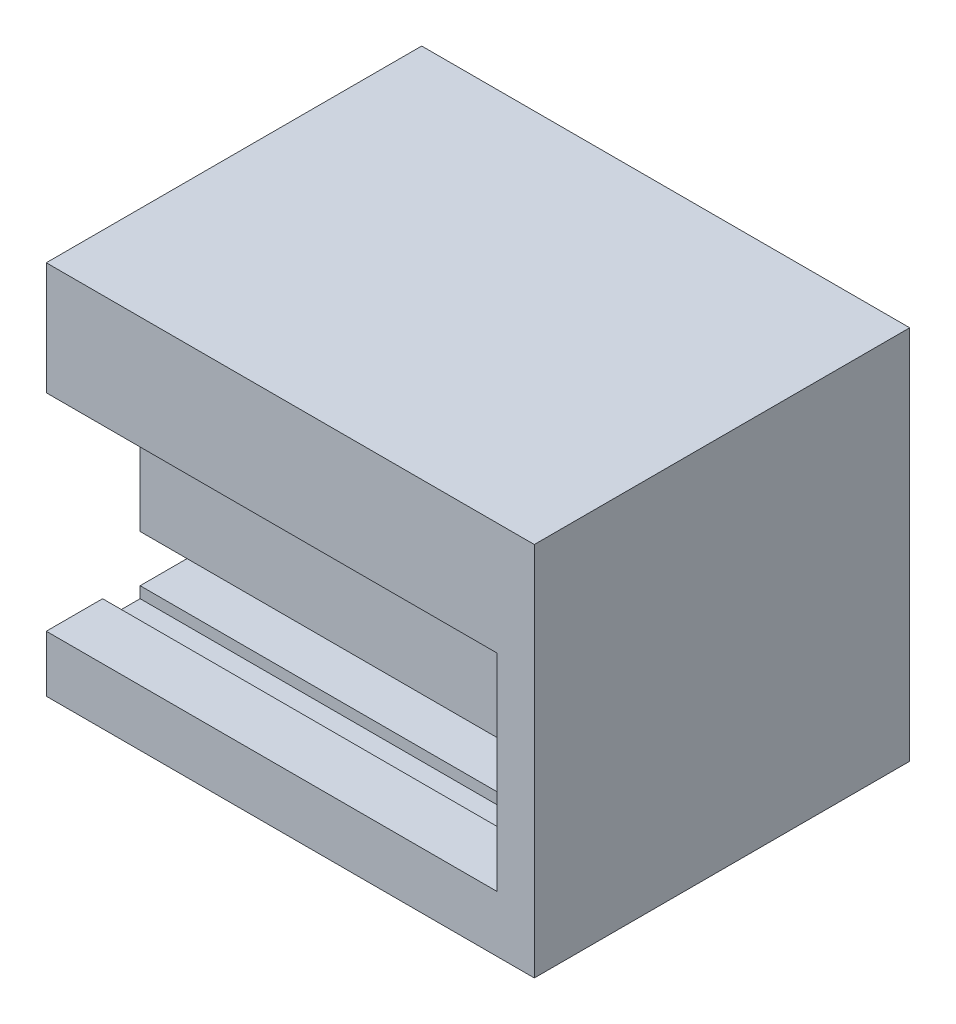
ISO-10303-21;
HEADER;
FILE_DESCRIPTION(('STEP AP214'),'2;1');
FILE_NAME('part.step','',(''),(''),'','','');
FILE_SCHEMA(('AUTOMOTIVE_DESIGN { 1 0 10303 214 1 1 1 1 }'));
ENDSEC;
DATA;
#1=APPLICATION_CONTEXT('core data for automotive mechanical design processes');
#2=APPLICATION_PROTOCOL_DEFINITION('international standard','automotive_design',2000,#1);
#3=PRODUCT_CONTEXT('',#1,'mechanical');
#4=PRODUCT('Part','Part','',(#3));
#5=PRODUCT_RELATED_PRODUCT_CATEGORY('part','',(#4));
#6=PRODUCT_DEFINITION_FORMATION('','',#4);
#7=PRODUCT_DEFINITION_CONTEXT('part definition',#1,'design');
#8=PRODUCT_DEFINITION('design','',#6,#7);
#9=PRODUCT_DEFINITION_SHAPE('','',#8);
#10=(LENGTH_UNIT() NAMED_UNIT(*) SI_UNIT(.MILLI.,.METRE.));
#11=(NAMED_UNIT(*) PLANE_ANGLE_UNIT() SI_UNIT($,.RADIAN.));
#12=(NAMED_UNIT(*) SI_UNIT($,.STERADIAN.) SOLID_ANGLE_UNIT());
#13=UNCERTAINTY_MEASURE_WITH_UNIT(LENGTH_MEASURE(1.E-05),#10,'distance_accuracy_value','');
#14=(GEOMETRIC_REPRESENTATION_CONTEXT(3) GLOBAL_UNCERTAINTY_ASSIGNED_CONTEXT((#13)) GLOBAL_UNIT_ASSIGNED_CONTEXT((#10,
#11,#12)) REPRESENTATION_CONTEXT('',''));
#15=CARTESIAN_POINT('',(0.,0.,0.));
#16=DIRECTION('',(0.,0.,1.));
#17=DIRECTION('',(1.,0.,0.));
#18=AXIS2_PLACEMENT_3D('',#15,#16,#17);
#19=CARTESIAN_POINT('',(-19.4844736842105,15.0951754385965,-25.4));
#20=DIRECTION('',(-1.,0.,0.));
#21=DIRECTION('',(0.,-1.,0.));
#22=AXIS2_PLACEMENT_3D('',#19,#20,#21);
#23=PLANE('',#22);
#24=DIRECTION('',(0.,-1.,0.));
#25=VECTOR('',#24,1.);
#26=CARTESIAN_POINT('',(-19.4844736842105,15.0951754385965,-3.81));
#27=LINE('',#26,#25);
#28=CARTESIAN_POINT('',(-19.4844736842105,12.5551754385965,-3.81));
#29=VERTEX_POINT('',#28);
#30=CARTESIAN_POINT('',(-19.4844736842105,7.47517543859648,-3.81));
#31=VERTEX_POINT('',#30);
#32=EDGE_CURVE('E201',#29,#31,#27,.T.);
#33=ORIENTED_EDGE('',*,*,#32,.T.);
#34=DIRECTION('',(0.,0.,1.));
#35=VECTOR('',#34,1.);
#36=CARTESIAN_POINT('',(-19.4844736842105,7.47517543859648,-25.4));
#37=LINE('',#36,#35);
#38=CARTESIAN_POINT('',(-19.4844736842105,7.47517543859648,0.));
#39=VERTEX_POINT('',#38);
#40=EDGE_CURVE('E203',#31,#39,#37,.T.);
#41=ORIENTED_EDGE('',*,*,#40,.T.);
#42=DIRECTION('',(0.,-1.,0.));
#43=VECTOR('',#42,1.);
#44=CARTESIAN_POINT('',(-19.4844736842105,15.0951754385965,0.));
#45=LINE('',#44,#43);
#46=CARTESIAN_POINT('',(-19.4844736842105,15.0951754385965,0.));
#47=VERTEX_POINT('',#46);
#48=EDGE_CURVE('E320',#47,#39,#45,.T.);
#49=ORIENTED_EDGE('',*,*,#48,.F.);
#50=DIRECTION('',(0.,0.,1.));
#51=VECTOR('',#50,1.);
#52=CARTESIAN_POINT('',(-19.4844736842105,15.0951754385965,-25.4));
#53=LINE('',#52,#51);
#54=CARTESIAN_POINT('',(-19.4844736842105,15.0951754385965,-25.4));
#55=VERTEX_POINT('',#54);
#56=EDGE_CURVE('E331',#55,#47,#53,.T.);
#57=ORIENTED_EDGE('',*,*,#56,.F.);
#58=DIRECTION('',(0.,-1.,0.));
#59=VECTOR('',#58,1.);
#60=CARTESIAN_POINT('',(-19.4844736842105,15.0951754385965,-25.4));
#61=LINE('',#60,#59);
#62=CARTESIAN_POINT('',(-19.4844736842105,-10.3048245614035,-25.4));
#63=VERTEX_POINT('',#62);
#64=EDGE_CURVE('E327',#55,#63,#61,.T.);
#65=ORIENTED_EDGE('',*,*,#64,.T.);
#66=DIRECTION('',(0.,0.,1.));
#67=VECTOR('',#66,1.);
#68=CARTESIAN_POINT('',(-19.4844736842105,-10.3048245614035,-25.4));
#69=LINE('',#68,#67);
#70=CARTESIAN_POINT('',(-19.4844736842105,-10.3048245614035,0.));
#71=VERTEX_POINT('',#70);
#72=EDGE_CURVE('E349',#63,#71,#69,.T.);
#73=ORIENTED_EDGE('',*,*,#72,.T.);
#74=CARTESIAN_POINT('',(-19.4844736842105,-6.49482456140353,0.));
#75=VERTEX_POINT('',#74);
#76=EDGE_CURVE('E343',#75,#71,#45,.T.);
#77=ORIENTED_EDGE('',*,*,#76,.F.);
#78=DIRECTION('',(0.,0.,-1.));
#79=VECTOR('',#78,1.);
#80=CARTESIAN_POINT('',(-19.4844736842105,-6.49482456140353,-25.4));
#81=LINE('',#80,#79);
#82=CARTESIAN_POINT('',(-19.4844736842105,-6.49482456140353,-3.81));
#83=VERTEX_POINT('',#82);
#84=EDGE_CURVE('E188',#75,#83,#81,.T.);
#85=ORIENTED_EDGE('',*,*,#84,.T.);
#86=DIRECTION('',(0.,-1.,0.));
#87=VECTOR('',#86,1.);
#88=CARTESIAN_POINT('',(-19.4844736842105,15.0951754385965,-3.81));
#89=LINE('',#88,#87);
#90=CARTESIAN_POINT('',(-19.4844736842105,-7.76482456140353,-3.81));
#91=VERTEX_POINT('',#90);
#92=EDGE_CURVE('E194',#83,#91,#89,.T.);
#93=ORIENTED_EDGE('',*,*,#92,.T.);
#94=DIRECTION('',(0.,0.,-1.));
#95=VECTOR('',#94,1.);
#96=CARTESIAN_POINT('',(-19.4844736842105,-7.76482456140352,-25.4));
#97=LINE('',#96,#95);
#98=CARTESIAN_POINT('',(-19.4844736842105,-7.76482456140353,-6.35));
#99=VERTEX_POINT('',#98);
#100=EDGE_CURVE('E172',#91,#99,#97,.T.);
#101=ORIENTED_EDGE('',*,*,#100,.T.);
#102=DIRECTION('',(0.,1.,0.));
#103=VECTOR('',#102,1.);
#104=CARTESIAN_POINT('',(-19.4844736842105,15.0951754385965,-6.35));
#105=LINE('',#104,#103);
#106=CARTESIAN_POINT('',(-19.4844736842105,-7.00282456140353,-6.35));
#107=VERTEX_POINT('',#106);
#108=EDGE_CURVE('E180',#99,#107,#105,.T.);
#109=ORIENTED_EDGE('',*,*,#108,.T.);
#110=DIRECTION('',(0.,0.,1.));
#111=VECTOR('',#110,1.);
#112=CARTESIAN_POINT('',(-19.4844736842105,-7.00282456140353,-25.4));
#113=LINE('',#112,#111);
#114=CARTESIAN_POINT('',(-19.4844736842105,-7.00282456140353,-19.05));
#115=VERTEX_POINT('',#114);
#116=EDGE_CURVE('E219',#115,#107,#113,.T.);
#117=ORIENTED_EDGE('',*,*,#116,.F.);
#118=DIRECTION('',(0.,-1.,0.));
#119=VECTOR('',#118,1.);
#120=CARTESIAN_POINT('',(-19.4844736842105,15.0951754385965,-19.05));
#121=LINE('',#120,#119);
#122=CARTESIAN_POINT('',(-19.4844736842105,-3.82782456140353,-19.05));
#123=VERTEX_POINT('',#122);
#124=EDGE_CURVE('E222',#123,#115,#121,.T.);
#125=ORIENTED_EDGE('',*,*,#124,.F.);
#126=DIRECTION('',(0.,0.,1.));
#127=VECTOR('',#126,1.);
#128=CARTESIAN_POINT('',(-19.4844736842105,-3.82782456140352,-25.4));
#129=LINE('',#128,#127);
#130=CARTESIAN_POINT('',(-19.4844736842105,-3.82782456140353,-6.35));
#131=VERTEX_POINT('',#130);
#132=EDGE_CURVE('E225',#123,#131,#129,.T.);
#133=ORIENTED_EDGE('',*,*,#132,.T.);
#134=CARTESIAN_POINT('',(-19.4844736842105,12.5551754385965,-6.35));
#135=VERTEX_POINT('',#134);
#136=EDGE_CURVE('E189',#131,#135,#105,.T.);
#137=ORIENTED_EDGE('',*,*,#136,.T.);
#138=DIRECTION('',(0.,0.,1.));
#139=VECTOR('',#138,1.);
#140=CARTESIAN_POINT('',(-19.4844736842105,12.5551754385965,-25.4));
#141=LINE('',#140,#139);
#142=EDGE_CURVE('E196',#135,#29,#141,.T.);
#143=ORIENTED_EDGE('',*,*,#142,.T.);
#144=EDGE_LOOP('',(#33,#41,#49,#57,#65,#73,#77,#85,#93,#101,#109,#117,#125,#133,#137,#143));
#145=FACE_BOUND('',#144,.T.);
#146=ADVANCED_FACE('F39',(#145),#23,.T.);
#147=CARTESIAN_POINT('',(0.,0.,0.));
#148=DIRECTION('',(0.,0.,-1.));
#149=DIRECTION('',(-1.,0.,0.));
#150=AXIS2_PLACEMENT_3D('',#147,#148,#149);
#151=PLANE('',#150);
#152=ORIENTED_EDGE('',*,*,#48,.T.);
#153=DIRECTION('',(1.,0.,0.));
#154=VECTOR('',#153,1.);
#155=CARTESIAN_POINT('',(-16.9444736842105,7.47517543859648,0.));
#156=LINE('',#155,#154);
#157=CARTESIAN_POINT('',(10.9955263157895,7.47517543859648,0.));
#158=VERTEX_POINT('',#157);
#159=EDGE_CURVE('E271',#39,#158,#156,.T.);
#160=ORIENTED_EDGE('',*,*,#159,.T.);
#161=DIRECTION('',(0.,-1.,0.));
#162=VECTOR('',#161,1.);
#163=CARTESIAN_POINT('',(10.9955263157895,7.47517543859648,0.));
#164=LINE('',#163,#162);
#165=CARTESIAN_POINT('',(10.9955263157895,-6.49482456140353,0.));
#166=VERTEX_POINT('',#165);
#167=EDGE_CURVE('E267',#158,#166,#164,.T.);
#168=ORIENTED_EDGE('',*,*,#167,.T.);
#169=DIRECTION('',(1.,0.,0.));
#170=VECTOR('',#169,1.);
#171=CARTESIAN_POINT('',(-16.9444736842105,-6.49482456140353,0.));
#172=LINE('',#171,#170);
#173=EDGE_CURVE('E63',#75,#166,#172,.T.);
#174=ORIENTED_EDGE('',*,*,#173,.F.);
#175=ORIENTED_EDGE('',*,*,#76,.T.);
#176=DIRECTION('',(1.,0.,0.));
#177=VECTOR('',#176,1.);
#178=CARTESIAN_POINT('',(-19.4844736842105,-10.3048245614035,0.));
#179=LINE('',#178,#177);
#180=CARTESIAN_POINT('',(13.5355263157895,-10.3048245614035,0.));
#181=VERTEX_POINT('',#180);
#182=EDGE_CURVE('E339',#71,#181,#179,.T.);
#183=ORIENTED_EDGE('',*,*,#182,.T.);
#184=DIRECTION('',(0.,-1.,0.));
#185=VECTOR('',#184,1.);
#186=CARTESIAN_POINT('',(13.5355263157895,15.0951754385965,0.));
#187=LINE('',#186,#185);
#188=CARTESIAN_POINT('',(13.5355263157895,15.0951754385965,0.));
#189=VERTEX_POINT('',#188);
#190=EDGE_CURVE('E335',#189,#181,#187,.T.);
#191=ORIENTED_EDGE('',*,*,#190,.F.);
#192=DIRECTION('',(1.,0.,0.));
#193=VECTOR('',#192,1.);
#194=CARTESIAN_POINT('',(-19.4844736842105,15.0951754385965,0.));
#195=LINE('',#194,#193);
#196=EDGE_CURVE('E298',#47,#189,#195,.T.);
#197=ORIENTED_EDGE('',*,*,#196,.F.);
#198=EDGE_LOOP('',(#152,#160,#168,#174,#175,#183,#191,#197));
#199=FACE_BOUND('',#198,.T.);
#200=ADVANCED_FACE('F363',(#199),#151,.F.);
#201=CARTESIAN_POINT('',(0.,0.,-6.35));
#202=DIRECTION('',(0.,0.,1.));
#203=DIRECTION('',(1.,0.,0.));
#204=AXIS2_PLACEMENT_3D('',#201,#202,#203);
#205=PLANE('',#204);
#206=DIRECTION('',(1.,0.,0.));
#207=VECTOR('',#206,1.);
#208=CARTESIAN_POINT('',(0.,12.5551754385965,-6.35));
#209=LINE('',#208,#207);
#210=CARTESIAN_POINT('',(10.9955263157895,12.5551754385965,-6.35));
#211=VERTEX_POINT('',#210);
#212=EDGE_CURVE('E299',#135,#211,#209,.T.);
#213=ORIENTED_EDGE('',*,*,#212,.F.);
#214=ORIENTED_EDGE('',*,*,#136,.F.);
#215=DIRECTION('',(1.,0.,0.));
#216=VECTOR('',#215,1.);
#217=CARTESIAN_POINT('',(0.,-3.82782456140353,-6.35));
#218=LINE('',#217,#216);
#219=CARTESIAN_POINT('',(4.96302631578948,-3.82782456140353,-6.35));
#220=VERTEX_POINT('',#219);
#221=EDGE_CURVE('E234',#131,#220,#218,.T.);
#222=ORIENTED_EDGE('',*,*,#221,.T.);
#223=DIRECTION('',(0.,-1.,0.));
#224=VECTOR('',#223,1.);
#225=CARTESIAN_POINT('',(4.96302631578948,0.,-6.35));
#226=LINE('',#225,#224);
#227=CARTESIAN_POINT('',(4.96302631578948,-7.00282456140353,-6.35));
#228=VERTEX_POINT('',#227);
#229=EDGE_CURVE('E247',#220,#228,#226,.T.);
#230=ORIENTED_EDGE('',*,*,#229,.T.);
#231=DIRECTION('',(1.,0.,0.));
#232=VECTOR('',#231,1.);
#233=CARTESIAN_POINT('',(0.,-7.00282456140353,-6.35));
#234=LINE('',#233,#232);
#235=EDGE_CURVE('E183',#107,#228,#234,.T.);
#236=ORIENTED_EDGE('',*,*,#235,.F.);
#237=ORIENTED_EDGE('',*,*,#108,.F.);
#238=DIRECTION('',(1.,0.,0.));
#239=VECTOR('',#238,1.);
#240=CARTESIAN_POINT('',(0.,-7.76482456140352,-6.35));
#241=LINE('',#240,#239);
#242=CARTESIAN_POINT('',(10.9955263157895,-7.76482456140352,-6.35));
#243=VERTEX_POINT('',#242);
#244=EDGE_CURVE('E167',#99,#243,#241,.T.);
#245=ORIENTED_EDGE('',*,*,#244,.T.);
#246=DIRECTION('',(0.,-1.,0.));
#247=VECTOR('',#246,1.);
#248=CARTESIAN_POINT('',(10.9955263157895,0.,-6.35));
#249=LINE('',#248,#247);
#250=EDGE_CURVE('E177',#211,#243,#249,.T.);
#251=ORIENTED_EDGE('',*,*,#250,.F.);
#252=EDGE_LOOP('',(#213,#214,#222,#230,#236,#237,#245,#251));
#253=FACE_BOUND('',#252,.T.);
#254=ADVANCED_FACE('F181',(#253),#205,.T.);
#255=CARTESIAN_POINT('',(0.,12.5551754385965,-6.35));
#256=DIRECTION('',(0.,-1.,0.));
#257=DIRECTION('',(0.,0.,-1.));
#258=AXIS2_PLACEMENT_3D('',#255,#256,#257);
#259=PLANE('',#258);
#260=DIRECTION('',(1.,0.,0.));
#261=VECTOR('',#260,1.);
#262=CARTESIAN_POINT('',(0.,12.5551754385965,-3.81));
#263=LINE('',#262,#261);
#264=CARTESIAN_POINT('',(10.9955263157895,12.5551754385965,-3.81));
#265=VERTEX_POINT('',#264);
#266=EDGE_CURVE('E303',#29,#265,#263,.T.);
#267=ORIENTED_EDGE('',*,*,#266,.F.);
#268=ORIENTED_EDGE('',*,*,#142,.F.);
#269=ORIENTED_EDGE('',*,*,#212,.T.);
#270=DIRECTION('',(0.,0.,1.));
#271=VECTOR('',#270,1.);
#272=CARTESIAN_POINT('',(10.9955263157895,12.5551754385965,-6.35));
#273=LINE('',#272,#271);
#274=EDGE_CURVE('E290',#211,#265,#273,.T.);
#275=ORIENTED_EDGE('',*,*,#274,.T.);
#276=EDGE_LOOP('',(#267,#268,#269,#275));
#277=FACE_BOUND('',#276,.T.);
#278=ADVANCED_FACE('F391',(#277),#259,.T.);
#279=CARTESIAN_POINT('',(0.,0.,-3.81));
#280=DIRECTION('',(0.,0.,1.));
#281=DIRECTION('',(1.,0.,0.));
#282=AXIS2_PLACEMENT_3D('',#279,#280,#281);
#283=PLANE('',#282);
#284=DIRECTION('',(1.,0.,0.));
#285=VECTOR('',#284,1.);
#286=CARTESIAN_POINT('',(0.,7.47517543859648,-3.81));
#287=LINE('',#286,#285);
#288=CARTESIAN_POINT('',(10.9955263157895,7.47517543859648,-3.81));
#289=VERTEX_POINT('',#288);
#290=EDGE_CURVE('E279',#31,#289,#287,.T.);
#291=ORIENTED_EDGE('',*,*,#290,.F.);
#292=ORIENTED_EDGE('',*,*,#32,.F.);
#293=ORIENTED_EDGE('',*,*,#266,.T.);
#294=DIRECTION('',(0.,-1.,0.));
#295=VECTOR('',#294,1.);
#296=CARTESIAN_POINT('',(10.9955263157895,0.,-3.81));
#297=LINE('',#296,#295);
#298=EDGE_CURVE('E306',#265,#289,#297,.T.);
#299=ORIENTED_EDGE('',*,*,#298,.T.);
#300=EDGE_LOOP('',(#291,#292,#293,#299));
#301=FACE_BOUND('',#300,.T.);
#302=ADVANCED_FACE('F446',(#301),#283,.F.);
#303=CARTESIAN_POINT('',(-16.9444736842105,-6.49482456140353,-6.35));
#304=DIRECTION('',(0.,-1.,0.));
#305=DIRECTION('',(0.,0.,-1.));
#306=AXIS2_PLACEMENT_3D('',#303,#304,#305);
#307=PLANE('',#306);
#308=DIRECTION('',(1.,0.,0.));
#309=VECTOR('',#308,1.);
#310=CARTESIAN_POINT('',(0.,-6.49482456140353,-3.81));
#311=LINE('',#310,#309);
#312=CARTESIAN_POINT('',(10.9955263157895,-6.49482456140353,-3.81));
#313=VERTEX_POINT('',#312);
#314=EDGE_CURVE('E289',#83,#313,#311,.T.);
#315=ORIENTED_EDGE('',*,*,#314,.F.);
#316=ORIENTED_EDGE('',*,*,#84,.F.);
#317=ORIENTED_EDGE('',*,*,#173,.T.);
#318=DIRECTION('',(0.,0.,1.));
#319=VECTOR('',#318,1.);
#320=CARTESIAN_POINT('',(10.9955263157895,-6.49482456140353,-6.35));
#321=LINE('',#320,#319);
#322=EDGE_CURVE('E275',#313,#166,#321,.T.);
#323=ORIENTED_EDGE('',*,*,#322,.F.);
#324=EDGE_LOOP('',(#315,#316,#317,#323));
#325=FACE_BOUND('',#324,.T.);
#326=ADVANCED_FACE('F379',(#325),#307,.F.);
#327=CARTESIAN_POINT('',(-16.9444736842105,7.47517543859648,-6.35));
#328=DIRECTION('',(0.,-1.,0.));
#329=DIRECTION('',(0.,0.,-1.));
#330=AXIS2_PLACEMENT_3D('',#327,#328,#329);
#331=PLANE('',#330);
#332=ORIENTED_EDGE('',*,*,#290,.T.);
#333=DIRECTION('',(0.,0.,1.));
#334=VECTOR('',#333,1.);
#335=CARTESIAN_POINT('',(10.9955263157895,7.47517543859648,-6.35));
#336=LINE('',#335,#334);
#337=EDGE_CURVE('E276',#289,#158,#336,.T.);
#338=ORIENTED_EDGE('',*,*,#337,.T.);
#339=ORIENTED_EDGE('',*,*,#159,.F.);
#340=ORIENTED_EDGE('',*,*,#40,.F.);
#341=EDGE_LOOP('',(#332,#338,#339,#340));
#342=FACE_BOUND('',#341,.T.);
#343=ADVANCED_FACE('F445',(#342),#331,.T.);
#344=CARTESIAN_POINT('',(10.9955263157895,0.,-6.35));
#345=DIRECTION('',(-1.,0.,0.));
#346=DIRECTION('',(0.,-1.,0.));
#347=AXIS2_PLACEMENT_3D('',#344,#345,#346);
#348=PLANE('',#347);
#349=DIRECTION('',(0.,-1.,0.));
#350=VECTOR('',#349,1.);
#351=CARTESIAN_POINT('',(10.9955263157895,0.,-3.81));
#352=LINE('',#351,#350);
#353=CARTESIAN_POINT('',(10.9955263157895,-7.76482456140352,-3.81));
#354=VERTEX_POINT('',#353);
#355=EDGE_CURVE('E285',#313,#354,#352,.T.);
#356=ORIENTED_EDGE('',*,*,#355,.F.);
#357=ORIENTED_EDGE('',*,*,#322,.T.);
#358=ORIENTED_EDGE('',*,*,#167,.F.);
#359=ORIENTED_EDGE('',*,*,#337,.F.);
#360=ORIENTED_EDGE('',*,*,#298,.F.);
#361=ORIENTED_EDGE('',*,*,#274,.F.);
#362=ORIENTED_EDGE('',*,*,#250,.T.);
#363=DIRECTION('',(0.,0.,1.));
#364=VECTOR('',#363,1.);
#365=CARTESIAN_POINT('',(10.9955263157895,-7.76482456140352,-6.35));
#366=LINE('',#365,#364);
#367=EDGE_CURVE('E174',#243,#354,#366,.T.);
#368=ORIENTED_EDGE('',*,*,#367,.T.);
#369=EDGE_LOOP('',(#356,#357,#358,#359,#360,#361,#362,#368));
#370=FACE_BOUND('',#369,.T.);
#371=ADVANCED_FACE('F384',(#370),#348,.T.);
#372=CARTESIAN_POINT('',(0.,-7.76482456140352,-6.35));
#373=DIRECTION('',(0.,-1.,0.));
#374=DIRECTION('',(1.,0.,0.));
#375=AXIS2_PLACEMENT_3D('',#372,#373,#374);
#376=PLANE('',#375);
#377=DIRECTION('',(1.,0.,0.));
#378=VECTOR('',#377,1.);
#379=CARTESIAN_POINT('',(0.,-7.76482456140352,-3.81));
#380=LINE('',#379,#378);
#381=EDGE_CURVE('E283',#91,#354,#380,.T.);
#382=ORIENTED_EDGE('',*,*,#381,.T.);
#383=ORIENTED_EDGE('',*,*,#367,.F.);
#384=ORIENTED_EDGE('',*,*,#244,.F.);
#385=ORIENTED_EDGE('',*,*,#100,.F.);
#386=EDGE_LOOP('',(#382,#383,#384,#385));
#387=FACE_BOUND('',#386,.T.);
#388=ADVANCED_FACE('F170',(#387),#376,.F.);
#389=CARTESIAN_POINT('',(0.,0.,-3.81));
#390=DIRECTION('',(0.,0.,1.));
#391=DIRECTION('',(1.,0.,0.));
#392=AXIS2_PLACEMENT_3D('',#389,#390,#391);
#393=PLANE('',#392);
#394=ORIENTED_EDGE('',*,*,#355,.T.);
#395=ORIENTED_EDGE('',*,*,#381,.F.);
#396=ORIENTED_EDGE('',*,*,#92,.F.);
#397=ORIENTED_EDGE('',*,*,#314,.T.);
#398=EDGE_LOOP('',(#394,#395,#396,#397));
#399=FACE_BOUND('',#398,.T.);
#400=ADVANCED_FACE('F382',(#399),#393,.F.);
#401=CARTESIAN_POINT('',(-19.4844736842105,15.0951754385965,-25.4));
#402=DIRECTION('',(0.,-1.,0.));
#403=DIRECTION('',(0.,0.,-1.));
#404=AXIS2_PLACEMENT_3D('',#401,#402,#403);
#405=PLANE('',#404);
#406=ORIENTED_EDGE('',*,*,#196,.T.);
#407=DIRECTION('',(0.,0.,1.));
#408=VECTOR('',#407,1.);
#409=CARTESIAN_POINT('',(13.5355263157895,15.0951754385965,-25.4));
#410=LINE('',#409,#408);
#411=CARTESIAN_POINT('',(13.5355263157895,15.0951754385965,-25.4));
#412=VERTEX_POINT('',#411);
#413=EDGE_CURVE('E11',#412,#189,#410,.T.);
#414=ORIENTED_EDGE('',*,*,#413,.F.);
#415=DIRECTION('',(1.,0.,0.));
#416=VECTOR('',#415,1.);
#417=CARTESIAN_POINT('',(-19.4844736842105,15.0951754385965,-25.4));
#418=LINE('',#417,#416);
#419=EDGE_CURVE('E315',#55,#412,#418,.T.);
#420=ORIENTED_EDGE('',*,*,#419,.F.);
#421=ORIENTED_EDGE('',*,*,#56,.T.);
#422=EDGE_LOOP('',(#406,#414,#420,#421));
#423=FACE_BOUND('',#422,.T.);
#424=ADVANCED_FACE('F41',(#423),#405,.F.);
#425=CARTESIAN_POINT('',(13.5355263157895,15.0951754385965,-25.4));
#426=DIRECTION('',(-1.,0.,0.));
#427=DIRECTION('',(0.,-1.,0.));
#428=AXIS2_PLACEMENT_3D('',#425,#426,#427);
#429=PLANE('',#428);
#430=ORIENTED_EDGE('',*,*,#190,.T.);
#431=DIRECTION('',(0.,0.,1.));
#432=VECTOR('',#431,1.);
#433=CARTESIAN_POINT('',(13.5355263157895,-10.3048245614035,-25.4));
#434=LINE('',#433,#432);
#435=CARTESIAN_POINT('',(13.5355263157895,-10.3048245614035,-25.4));
#436=VERTEX_POINT('',#435);
#437=EDGE_CURVE('E48',#436,#181,#434,.T.);
#438=ORIENTED_EDGE('',*,*,#437,.F.);
#439=DIRECTION('',(0.,-1.,0.));
#440=VECTOR('',#439,1.);
#441=CARTESIAN_POINT('',(13.5355263157895,15.0951754385965,-25.4));
#442=LINE('',#441,#440);
#443=EDGE_CURVE('E319',#412,#436,#442,.T.);
#444=ORIENTED_EDGE('',*,*,#443,.F.);
#445=ORIENTED_EDGE('',*,*,#413,.T.);
#446=EDGE_LOOP('',(#430,#438,#444,#445));
#447=FACE_BOUND('',#446,.T.);
#448=ADVANCED_FACE('F359',(#447),#429,.F.);
#449=CARTESIAN_POINT('',(-19.4844736842105,-10.3048245614035,-25.4));
#450=DIRECTION('',(0.,-1.,0.));
#451=DIRECTION('',(0.,0.,-1.));
#452=AXIS2_PLACEMENT_3D('',#449,#450,#451);
#453=PLANE('',#452);
#454=ORIENTED_EDGE('',*,*,#182,.F.);
#455=ORIENTED_EDGE('',*,*,#72,.F.);
#456=DIRECTION('',(1.,0.,0.));
#457=VECTOR('',#456,1.);
#458=CARTESIAN_POINT('',(-19.4844736842105,-10.3048245614035,-25.4));
#459=LINE('',#458,#457);
#460=EDGE_CURVE('E323',#63,#436,#459,.T.);
#461=ORIENTED_EDGE('',*,*,#460,.T.);
#462=ORIENTED_EDGE('',*,*,#437,.T.);
#463=EDGE_LOOP('',(#454,#455,#461,#462));
#464=FACE_BOUND('',#463,.T.);
#465=ADVANCED_FACE('F356',(#464),#453,.T.);
#466=CARTESIAN_POINT('',(0.,0.,-25.4));
#467=DIRECTION('',(0.,0.,-1.));
#468=DIRECTION('',(-1.,0.,0.));
#469=AXIS2_PLACEMENT_3D('',#466,#467,#468);
#470=PLANE('',#469);
#471=DIRECTION('',(0.,-1.,0.));
#472=VECTOR('',#471,1.);
#473=CARTESIAN_POINT('',(-10.9119736842105,0.,-25.4));
#474=LINE('',#473,#472);
#475=CARTESIAN_POINT('',(-10.9119736842105,-3.82782456140353,-25.4));
#476=VERTEX_POINT('',#475);
#477=CARTESIAN_POINT('',(-10.9119736842105,-7.00282456140353,-25.4));
#478=VERTEX_POINT('',#477);
#479=EDGE_CURVE('E229',#476,#478,#474,.T.);
#480=ORIENTED_EDGE('',*,*,#479,.T.);
#481=DIRECTION('',(1.,0.,0.));
#482=VECTOR('',#481,1.);
#483=CARTESIAN_POINT('',(0.,-7.00282456140353,-25.4));
#484=LINE('',#483,#482);
#485=CARTESIAN_POINT('',(4.96302631578948,-7.00282456140353,-25.4));
#486=VERTEX_POINT('',#485);
#487=EDGE_CURVE('E233',#478,#486,#484,.T.);
#488=ORIENTED_EDGE('',*,*,#487,.T.);
#489=DIRECTION('',(0.,-1.,0.));
#490=VECTOR('',#489,1.);
#491=CARTESIAN_POINT('',(4.96302631578948,0.,-25.4));
#492=LINE('',#491,#490);
#493=CARTESIAN_POINT('',(4.96302631578948,-3.82782456140353,-25.4));
#494=VERTEX_POINT('',#493);
#495=EDGE_CURVE('E238',#494,#486,#492,.T.);
#496=ORIENTED_EDGE('',*,*,#495,.F.);
#497=DIRECTION('',(1.,0.,0.));
#498=VECTOR('',#497,1.);
#499=CARTESIAN_POINT('',(0.,-3.82782456140353,-25.4));
#500=LINE('',#499,#498);
#501=EDGE_CURVE('E241',#476,#494,#500,.T.);
#502=ORIENTED_EDGE('',*,*,#501,.F.);
#503=EDGE_LOOP('',(#480,#488,#496,#502));
#504=FACE_BOUND('',#503,.T.);
#505=ORIENTED_EDGE('',*,*,#419,.T.);
#506=ORIENTED_EDGE('',*,*,#443,.T.);
#507=ORIENTED_EDGE('',*,*,#460,.F.);
#508=ORIENTED_EDGE('',*,*,#64,.F.);
#509=EDGE_LOOP('',(#505,#506,#507,#508));
#510=FACE_BOUND('',#509,.T.);
#511=ADVANCED_FACE('F368',(#504,#510),#470,.T.);
#512=CARTESIAN_POINT('',(-10.9119736842105,0.,-25.4));
#513=DIRECTION('',(-1.,0.,0.));
#514=DIRECTION('',(0.,0.,1.));
#515=AXIS2_PLACEMENT_3D('',#512,#513,#514);
#516=PLANE('',#515);
#517=DIRECTION('',(0.,0.,1.));
#518=VECTOR('',#517,1.);
#519=CARTESIAN_POINT('',(-10.9119736842105,-3.82782456140353,-25.4));
#520=LINE('',#519,#518);
#521=CARTESIAN_POINT('',(-10.9119736842105,-3.82782456140353,-19.05));
#522=VERTEX_POINT('',#521);
#523=EDGE_CURVE('E253',#476,#522,#520,.T.);
#524=ORIENTED_EDGE('',*,*,#523,.T.);
#525=DIRECTION('',(0.,1.,0.));
#526=VECTOR('',#525,1.);
#527=CARTESIAN_POINT('',(-10.9119736842105,-7.00282456140353,-19.05));
#528=LINE('',#527,#526);
#529=CARTESIAN_POINT('',(-10.9119736842105,-7.00282456140353,-19.05));
#530=VERTEX_POINT('',#529);
#531=EDGE_CURVE('E209',#530,#522,#528,.T.);
#532=ORIENTED_EDGE('',*,*,#531,.F.);
#533=DIRECTION('',(0.,0.,1.));
#534=VECTOR('',#533,1.);
#535=CARTESIAN_POINT('',(-10.9119736842105,-7.00282456140353,-25.4));
#536=LINE('',#535,#534);
#537=EDGE_CURVE('E244',#478,#530,#536,.T.);
#538=ORIENTED_EDGE('',*,*,#537,.F.);
#539=ORIENTED_EDGE('',*,*,#479,.F.);
#540=EDGE_LOOP('',(#524,#532,#538,#539));
#541=FACE_BOUND('',#540,.T.);
#542=ADVANCED_FACE('F411',(#541),#516,.F.);
#543=CARTESIAN_POINT('',(0.,-3.82782456140353,-25.4));
#544=DIRECTION('',(0.,-1.,0.));
#545=DIRECTION('',(0.,0.,-1.));
#546=AXIS2_PLACEMENT_3D('',#543,#544,#545);
#547=PLANE('',#546);
#548=ORIENTED_EDGE('',*,*,#221,.F.);
#549=ORIENTED_EDGE('',*,*,#132,.F.);
#550=DIRECTION('',(1.,0.,0.));
#551=VECTOR('',#550,1.);
#552=CARTESIAN_POINT('',(-29.9619736842105,-3.82782456140353,-19.05));
#553=LINE('',#552,#551);
#554=EDGE_CURVE('E216',#123,#522,#553,.T.);
#555=ORIENTED_EDGE('',*,*,#554,.T.);
#556=ORIENTED_EDGE('',*,*,#523,.F.);
#557=ORIENTED_EDGE('',*,*,#501,.T.);
#558=DIRECTION('',(0.,0.,1.));
#559=VECTOR('',#558,1.);
#560=CARTESIAN_POINT('',(4.96302631578948,-3.82782456140353,-25.4));
#561=LINE('',#560,#559);
#562=EDGE_CURVE('E257',#494,#220,#561,.T.);
#563=ORIENTED_EDGE('',*,*,#562,.T.);
#564=EDGE_LOOP('',(#548,#549,#555,#556,#557,#563));
#565=FACE_BOUND('',#564,.T.);
#566=ADVANCED_FACE('F397',(#565),#547,.T.);
#567=CARTESIAN_POINT('',(4.96302631578948,0.,-25.4));
#568=DIRECTION('',(-1.,0.,0.));
#569=DIRECTION('',(0.,0.,1.));
#570=AXIS2_PLACEMENT_3D('',#567,#568,#569);
#571=PLANE('',#570);
#572=ORIENTED_EDGE('',*,*,#229,.F.);
#573=ORIENTED_EDGE('',*,*,#562,.F.);
#574=ORIENTED_EDGE('',*,*,#495,.T.);
#575=DIRECTION('',(0.,0.,1.));
#576=VECTOR('',#575,1.);
#577=CARTESIAN_POINT('',(4.96302631578948,-7.00282456140353,-25.4));
#578=LINE('',#577,#576);
#579=EDGE_CURVE('E55',#486,#228,#578,.T.);
#580=ORIENTED_EDGE('',*,*,#579,.T.);
#581=EDGE_LOOP('',(#572,#573,#574,#580));
#582=FACE_BOUND('',#581,.T.);
#583=ADVANCED_FACE('F403',(#582),#571,.T.);
#584=CARTESIAN_POINT('',(0.,-7.00282456140353,-25.4));
#585=DIRECTION('',(0.,-1.,0.));
#586=DIRECTION('',(0.,0.,-1.));
#587=AXIS2_PLACEMENT_3D('',#584,#585,#586);
#588=PLANE('',#587);
#589=ORIENTED_EDGE('',*,*,#235,.T.);
#590=ORIENTED_EDGE('',*,*,#579,.F.);
#591=ORIENTED_EDGE('',*,*,#487,.F.);
#592=ORIENTED_EDGE('',*,*,#537,.T.);
#593=DIRECTION('',(1.,0.,0.));
#594=VECTOR('',#593,1.);
#595=CARTESIAN_POINT('',(-29.9619736842105,-7.00282456140353,-19.05));
#596=LINE('',#595,#594);
#597=EDGE_CURVE('E213',#115,#530,#596,.T.);
#598=ORIENTED_EDGE('',*,*,#597,.F.);
#599=ORIENTED_EDGE('',*,*,#116,.T.);
#600=EDGE_LOOP('',(#589,#590,#591,#592,#598,#599));
#601=FACE_BOUND('',#600,.T.);
#602=ADVANCED_FACE('F404',(#601),#588,.F.);
#603=CARTESIAN_POINT('',(-29.9619736842105,-7.00282456140353,-19.05));
#604=DIRECTION('',(0.,0.,-1.));
#605=DIRECTION('',(-1.,0.,0.));
#606=AXIS2_PLACEMENT_3D('',#603,#604,#605);
#607=PLANE('',#606);
#608=ORIENTED_EDGE('',*,*,#124,.T.);
#609=ORIENTED_EDGE('',*,*,#597,.T.);
#610=ORIENTED_EDGE('',*,*,#531,.T.);
#611=ORIENTED_EDGE('',*,*,#554,.F.);
#612=EDGE_LOOP('',(#608,#609,#610,#611));
#613=FACE_BOUND('',#612,.T.);
#614=ADVANCED_FACE('F407',(#613),#607,.F.);
#615=CLOSED_SHELL('',(#146,#200,#254,#278,#302,#326,#343,#371,#388,#400,#424,#448,#465,#511,
#542,#566,#583,#602,#614));
#616=MANIFOLD_SOLID_BREP('B2',#615);
#617=ADVANCED_BREP_SHAPE_REPRESENTATION('',(#18,#616),#14);
#618=SHAPE_DEFINITION_REPRESENTATION(#9,#617);
ENDSEC;
END-ISO-10303-21;
